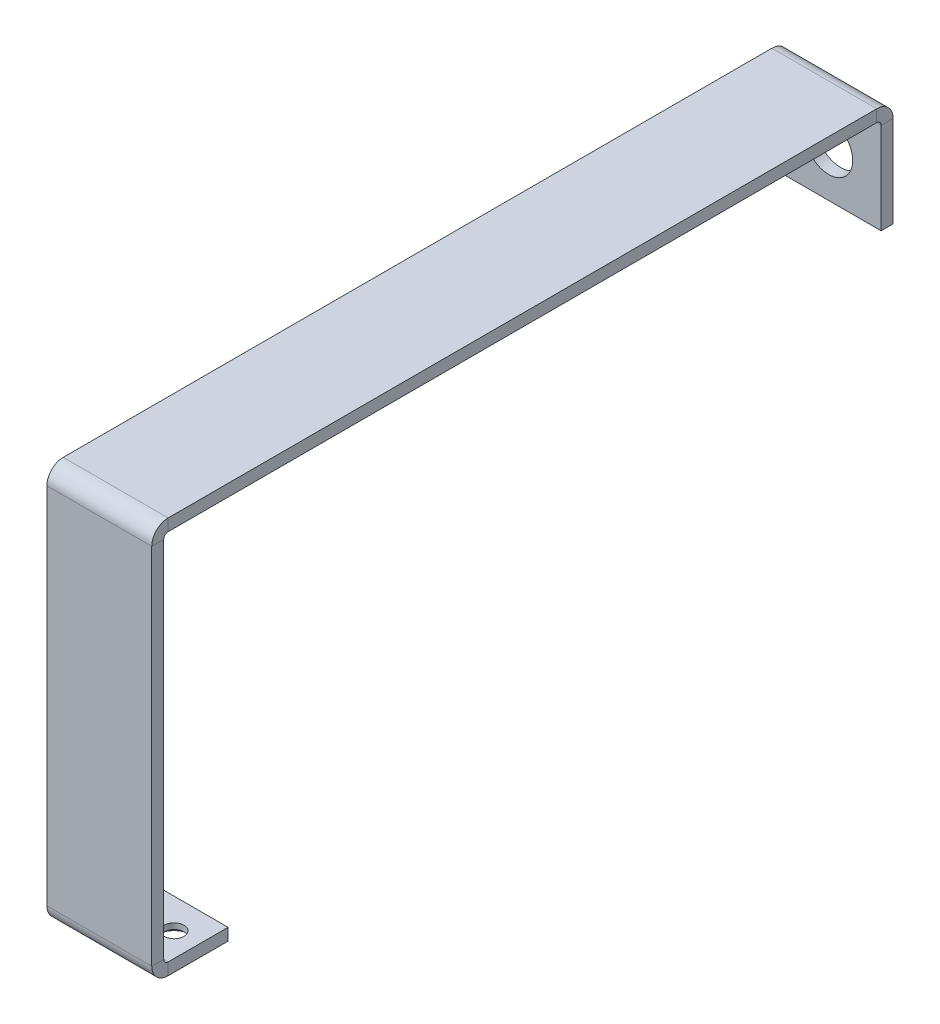
ISO-10303-21;
HEADER;
FILE_DESCRIPTION(('STEP AP214'),'2;1');
FILE_NAME('part.step','',(''),(''),'','','');
FILE_SCHEMA(('AUTOMOTIVE_DESIGN { 1 0 10303 214 1 1 1 1 }'));
ENDSEC;
DATA;
#1=APPLICATION_CONTEXT('core data for automotive mechanical design processes');
#2=APPLICATION_PROTOCOL_DEFINITION('international standard','automotive_design',2000,#1);
#3=PRODUCT_CONTEXT('',#1,'mechanical');
#4=PRODUCT('Part','Part','',(#3));
#5=PRODUCT_RELATED_PRODUCT_CATEGORY('part','',(#4));
#6=PRODUCT_DEFINITION_FORMATION('','',#4);
#7=PRODUCT_DEFINITION_CONTEXT('part definition',#1,'design');
#8=PRODUCT_DEFINITION('design','',#6,#7);
#9=PRODUCT_DEFINITION_SHAPE('','',#8);
#10=(LENGTH_UNIT() NAMED_UNIT(*) SI_UNIT(.MILLI.,.METRE.));
#11=(NAMED_UNIT(*) PLANE_ANGLE_UNIT() SI_UNIT($,.RADIAN.));
#12=(NAMED_UNIT(*) SI_UNIT($,.STERADIAN.) SOLID_ANGLE_UNIT());
#13=UNCERTAINTY_MEASURE_WITH_UNIT(LENGTH_MEASURE(1.E-05),#10,'distance_accuracy_value','');
#14=(GEOMETRIC_REPRESENTATION_CONTEXT(3) GLOBAL_UNCERTAINTY_ASSIGNED_CONTEXT((#13)) GLOBAL_UNIT_ASSIGNED_CONTEXT((#10,
#11,#12)) REPRESENTATION_CONTEXT('',''));
#15=CARTESIAN_POINT('',(0.,0.,0.));
#16=DIRECTION('',(0.,0.,1.));
#17=DIRECTION('',(1.,0.,0.));
#18=AXIS2_PLACEMENT_3D('',#15,#16,#17);
#19=CARTESIAN_POINT('',(0.,2.,0.));
#20=DIRECTION('',(0.,1.,0.));
#21=DIRECTION('',(0.,0.,1.));
#22=AXIS2_PLACEMENT_3D('',#19,#20,#21);
#23=PLANE('',#22);
#24=CARTESIAN_POINT('',(-4.75,2.,0.));
#25=DIRECTION('',(0.,1.,0.));
#26=DIRECTION('',(0.,0.,1.));
#27=AXIS2_PLACEMENT_3D('',#24,#25,#26);
#28=CIRCLE('',#27,1.63194999999999);
#29=CARTESIAN_POINT('',(-4.75,2.,1.63194999999999));
#30=VERTEX_POINT('',#29);
#31=EDGE_CURVE('E450',#30,#30,#28,.F.);
#32=ORIENTED_EDGE('',*,*,#31,.T.);
#33=EDGE_LOOP('',(#32));
#34=FACE_BOUND('',#33,.T.);
#35=DIRECTION('',(0.,0.,-1.));
#36=VECTOR('',#35,1.);
#37=CARTESIAN_POINT('',(8.75,2.,-5.));
#38=LINE('',#37,#36);
#39=CARTESIAN_POINT('',(8.75,2.,5.));
#40=VERTEX_POINT('',#39);
#41=CARTESIAN_POINT('',(8.75,2.,-5.));
#42=VERTEX_POINT('',#41);
#43=EDGE_CURVE('E356',#40,#42,#38,.T.);
#44=ORIENTED_EDGE('',*,*,#43,.T.);
#45=DIRECTION('',(-1.,0.,0.));
#46=VECTOR('',#45,1.);
#47=CARTESIAN_POINT('',(-8.75,2.,-5.));
#48=LINE('',#47,#46);
#49=CARTESIAN_POINT('',(-8.75,2.,-5.));
#50=VERTEX_POINT('',#49);
#51=EDGE_CURVE('E359',#42,#50,#48,.T.);
#52=ORIENTED_EDGE('',*,*,#51,.T.);
#53=DIRECTION('',(0.,0.,1.));
#54=VECTOR('',#53,1.);
#55=CARTESIAN_POINT('',(-8.75,2.,-5.));
#56=LINE('',#55,#54);
#57=CARTESIAN_POINT('',(-8.75,2.,5.));
#58=VERTEX_POINT('',#57);
#59=EDGE_CURVE('E362',#50,#58,#56,.T.);
#60=ORIENTED_EDGE('',*,*,#59,.T.);
#61=DIRECTION('',(1.,0.,0.));
#62=VECTOR('',#61,1.);
#63=CARTESIAN_POINT('',(-8.75,2.,5.));
#64=LINE('',#63,#62);
#65=EDGE_CURVE('E364',#58,#40,#64,.T.);
#66=ORIENTED_EDGE('',*,*,#65,.T.);
#67=EDGE_LOOP('',(#44,#52,#60,#66));
#68=FACE_BOUND('',#67,.T.);
#69=CARTESIAN_POINT('',(4.75,2.,0.));
#70=DIRECTION('',(0.,1.,0.));
#71=DIRECTION('',(0.,0.,1.));
#72=AXIS2_PLACEMENT_3D('',#69,#70,#71);
#73=CIRCLE('',#72,1.63194999999999);
#74=CARTESIAN_POINT('',(4.75,2.,1.63194999999999));
#75=VERTEX_POINT('',#74);
#76=EDGE_CURVE('E441',#75,#75,#73,.F.);
#77=ORIENTED_EDGE('',*,*,#76,.T.);
#78=EDGE_LOOP('',(#77));
#79=FACE_BOUND('',#78,.T.);
#80=ADVANCED_FACE('F103',(#34,#68,#79),#23,.T.);
#81=CARTESIAN_POINT('',(8.74999999999997,66.1500000000004,-115.9484));
#82=DIRECTION('',(-1.,0.,0.));
#83=DIRECTION('',(0.,0.,1.));
#84=AXIS2_PLACEMENT_3D('',#81,#82,#83);
#85=PLANE('',#84);
#86=DIRECTION('',(0.,1.,0.));
#87=VECTOR('',#86,1.);
#88=CARTESIAN_POINT('',(8.75,64.1500000000004,-113.2118));
#89=LINE('',#88,#87);
#90=CARTESIAN_POINT('',(8.74999999999997,64.1500000000004,-113.2118));
#91=VERTEX_POINT('',#90);
#92=CARTESIAN_POINT('',(8.75,66.1500000000004,-113.2118));
#93=VERTEX_POINT('',#92);
#94=EDGE_CURVE('E269',#91,#93,#89,.T.);
#95=ORIENTED_EDGE('',*,*,#94,.T.);
#96=DIRECTION('',(0.,0.,-1.));
#97=VECTOR('',#96,1.);
#98=CARTESIAN_POINT('',(8.74999999999999,66.15,2.39730434382182E-13));
#99=LINE('',#98,#97);
#100=CARTESIAN_POINT('',(8.74999999999999,66.15,5.));
#101=VERTEX_POINT('',#100);
#102=EDGE_CURVE('E288',#101,#93,#99,.T.);
#103=ORIENTED_EDGE('',*,*,#102,.F.);
#104=DIRECTION('',(0.,-1.,0.));
#105=VECTOR('',#104,1.);
#106=CARTESIAN_POINT('',(8.74999999999999,64.15,4.99999999999999));
#107=LINE('',#106,#105);
#108=CARTESIAN_POINT('',(8.74999999999999,64.15,4.99999999999999));
#109=VERTEX_POINT('',#108);
#110=EDGE_CURVE('E297',#109,#101,#107,.F.);
#111=ORIENTED_EDGE('',*,*,#110,.F.);
#112=DIRECTION('',(0.,0.,1.));
#113=VECTOR('',#112,1.);
#114=CARTESIAN_POINT('',(8.74999999999997,64.1500000000004,-115.9484));
#115=LINE('',#114,#113);
#116=EDGE_CURVE('E292',#109,#91,#115,.F.);
#117=ORIENTED_EDGE('',*,*,#116,.T.);
#118=EDGE_LOOP('',(#95,#103,#111,#117));
#119=FACE_BOUND('',#118,.T.);
#120=ADVANCED_FACE('F421',(#119),#85,.F.);
#121=CARTESIAN_POINT('',(-8.75000000000002,66.15,5.7366));
#122=DIRECTION('',(1.,0.,0.));
#123=DIRECTION('',(0.,0.,-1.));
#124=AXIS2_PLACEMENT_3D('',#121,#122,#123);
#125=PLANE('',#124);
#126=DIRECTION('',(0.,1.,0.));
#127=VECTOR('',#126,1.);
#128=CARTESIAN_POINT('',(-8.75,64.1500000000004,-113.2118));
#129=LINE('',#128,#127);
#130=CARTESIAN_POINT('',(-8.75,64.1500000000004,-113.2118));
#131=VERTEX_POINT('',#130);
#132=CARTESIAN_POINT('',(-8.75,66.1500000000004,-113.2118));
#133=VERTEX_POINT('',#132);
#134=EDGE_CURVE('E279',#131,#133,#129,.T.);
#135=ORIENTED_EDGE('',*,*,#134,.F.);
#136=DIRECTION('',(0.,0.,-1.));
#137=VECTOR('',#136,1.);
#138=CARTESIAN_POINT('',(-8.75000000000002,64.15,5.7366));
#139=LINE('',#138,#137);
#140=CARTESIAN_POINT('',(-8.75000000000002,64.15,4.99999999999999));
#141=VERTEX_POINT('',#140);
#142=EDGE_CURVE('E290',#131,#141,#139,.F.);
#143=ORIENTED_EDGE('',*,*,#142,.T.);
#144=DIRECTION('',(0.,-1.,0.));
#145=VECTOR('',#144,1.);
#146=CARTESIAN_POINT('',(-8.75000000000002,66.15,5.));
#147=LINE('',#146,#145);
#148=CARTESIAN_POINT('',(-8.75000000000002,66.15,5.));
#149=VERTEX_POINT('',#148);
#150=EDGE_CURVE('E282',#141,#149,#147,.F.);
#151=ORIENTED_EDGE('',*,*,#150,.T.);
#152=DIRECTION('',(0.,0.,1.));
#153=VECTOR('',#152,1.);
#154=CARTESIAN_POINT('',(-8.75000000000002,66.15,2.40853082808308E-13));
#155=LINE('',#154,#153);
#156=EDGE_CURVE('E285',#133,#149,#155,.T.);
#157=ORIENTED_EDGE('',*,*,#156,.F.);
#158=EDGE_LOOP('',(#135,#143,#151,#157));
#159=FACE_BOUND('',#158,.T.);
#160=ADVANCED_FACE('F495',(#159),#125,.F.);
#161=CARTESIAN_POINT('',(0.,66.15,2.40853082808308E-13));
#162=DIRECTION('',(0.,-1.,0.));
#163=DIRECTION('',(0.,0.,-1.));
#164=AXIS2_PLACEMENT_3D('',#161,#162,#163);
#165=PLANE('',#164);
#166=DIRECTION('',(1.,0.,0.));
#167=VECTOR('',#166,1.);
#168=CARTESIAN_POINT('',(8.75,66.1500000000004,-113.2118));
#169=LINE('',#168,#167);
#170=EDGE_CURVE('E263',#93,#133,#169,.F.);
#171=ORIENTED_EDGE('',*,*,#170,.T.);
#172=ORIENTED_EDGE('',*,*,#156,.T.);
#173=DIRECTION('',(1.,0.,0.));
#174=VECTOR('',#173,1.);
#175=CARTESIAN_POINT('',(-8.75000000000002,66.15,5.));
#176=LINE('',#175,#174);
#177=EDGE_CURVE('E294',#101,#149,#176,.F.);
#178=ORIENTED_EDGE('',*,*,#177,.F.);
#179=ORIENTED_EDGE('',*,*,#102,.T.);
#180=EDGE_LOOP('',(#171,#172,#178,#179));
#181=FACE_BOUND('',#180,.T.);
#182=ADVANCED_FACE('F419',(#181),#165,.F.);
#183=CARTESIAN_POINT('',(0.,64.15,2.33870120130622E-13));
#184=DIRECTION('',(0.,-1.,0.));
#185=DIRECTION('',(0.,0.,-1.));
#186=AXIS2_PLACEMENT_3D('',#183,#184,#185);
#187=PLANE('',#186);
#188=ORIENTED_EDGE('',*,*,#142,.F.);
#189=DIRECTION('',(1.,0.,0.));
#190=VECTOR('',#189,1.);
#191=CARTESIAN_POINT('',(8.75,64.1500000000004,-113.2118));
#192=LINE('',#191,#190);
#193=EDGE_CURVE('E118',#91,#131,#192,.F.);
#194=ORIENTED_EDGE('',*,*,#193,.F.);
#195=ORIENTED_EDGE('',*,*,#116,.F.);
#196=DIRECTION('',(1.,0.,0.));
#197=VECTOR('',#196,1.);
#198=CARTESIAN_POINT('',(-8.75000000000002,64.15,4.99999999999999));
#199=LINE('',#198,#197);
#200=EDGE_CURVE('E300',#141,#109,#199,.T.);
#201=ORIENTED_EDGE('',*,*,#200,.F.);
#202=EDGE_LOOP('',(#188,#194,#195,#201));
#203=FACE_BOUND('',#202,.T.);
#204=ADVANCED_FACE('F527',(#203),#187,.T.);
#205=CARTESIAN_POINT('',(8.74999999999999,66.15,7.7366));
#206=DIRECTION('',(-1.,0.,0.));
#207=DIRECTION('',(0.,-1.,0.));
#208=AXIS2_PLACEMENT_3D('',#205,#206,#207);
#209=PLANE('',#208);
#210=DIRECTION('',(0.,0.,1.));
#211=VECTOR('',#210,1.);
#212=CARTESIAN_POINT('',(8.74999999999999,63.4134,5.73659999999999));
#213=LINE('',#212,#211);
#214=CARTESIAN_POINT('',(8.74999999999999,63.4134,5.7366));
#215=VERTEX_POINT('',#214);
#216=CARTESIAN_POINT('',(8.74999999999999,63.4134,7.73659999999999));
#217=VERTEX_POINT('',#216);
#218=EDGE_CURVE('E310',#215,#217,#213,.T.);
#219=ORIENTED_EDGE('',*,*,#218,.T.);
#220=DIRECTION('',(0.,1.,0.));
#221=VECTOR('',#220,1.);
#222=CARTESIAN_POINT('',(8.74999999999999,0.,7.7366));
#223=LINE('',#222,#221);
#224=CARTESIAN_POINT('',(8.74999999999999,2.7366,7.7366));
#225=VERTEX_POINT('',#224);
#226=EDGE_CURVE('E328',#225,#217,#223,.T.);
#227=ORIENTED_EDGE('',*,*,#226,.F.);
#228=DIRECTION('',(0.,0.,-1.));
#229=VECTOR('',#228,1.);
#230=CARTESIAN_POINT('',(8.74999999999999,2.7366,5.7366));
#231=LINE('',#230,#229);
#232=CARTESIAN_POINT('',(8.74999999999999,2.7366,5.7366));
#233=VERTEX_POINT('',#232);
#234=EDGE_CURVE('E337',#233,#225,#231,.F.);
#235=ORIENTED_EDGE('',*,*,#234,.F.);
#236=DIRECTION('',(0.,-1.,0.));
#237=VECTOR('',#236,1.);
#238=CARTESIAN_POINT('',(8.74999999999999,66.15,5.7366));
#239=LINE('',#238,#237);
#240=EDGE_CURVE('E332',#233,#215,#239,.F.);
#241=ORIENTED_EDGE('',*,*,#240,.T.);
#242=EDGE_LOOP('',(#219,#227,#235,#241));
#243=FACE_BOUND('',#242,.T.);
#244=ADVANCED_FACE('F405',(#243),#209,.F.);
#245=CARTESIAN_POINT('',(-8.74999999999999,2.,7.7366));
#246=DIRECTION('',(1.,0.,0.));
#247=DIRECTION('',(0.,1.,0.));
#248=AXIS2_PLACEMENT_3D('',#245,#246,#247);
#249=PLANE('',#248);
#250=DIRECTION('',(0.,0.,1.));
#251=VECTOR('',#250,1.);
#252=CARTESIAN_POINT('',(-8.75000000000002,63.4134,5.73659999999999));
#253=LINE('',#252,#251);
#254=CARTESIAN_POINT('',(-8.75000000000002,63.4134,5.73659999999999));
#255=VERTEX_POINT('',#254);
#256=CARTESIAN_POINT('',(-8.75000000000002,63.4134,7.7366));
#257=VERTEX_POINT('',#256);
#258=EDGE_CURVE('E319',#255,#257,#253,.T.);
#259=ORIENTED_EDGE('',*,*,#258,.F.);
#260=DIRECTION('',(0.,1.,0.));
#261=VECTOR('',#260,1.);
#262=CARTESIAN_POINT('',(-8.74999999999999,2.,5.7366));
#263=LINE('',#262,#261);
#264=CARTESIAN_POINT('',(-8.74999999999998,2.7366,5.7366));
#265=VERTEX_POINT('',#264);
#266=EDGE_CURVE('E330',#255,#265,#263,.F.);
#267=ORIENTED_EDGE('',*,*,#266,.T.);
#268=DIRECTION('',(0.,0.,-1.));
#269=VECTOR('',#268,1.);
#270=CARTESIAN_POINT('',(-8.74999999999999,2.7366,7.7366));
#271=LINE('',#270,#269);
#272=CARTESIAN_POINT('',(-8.74999999999998,2.7366,7.7366));
#273=VERTEX_POINT('',#272);
#274=EDGE_CURVE('E322',#265,#273,#271,.F.);
#275=ORIENTED_EDGE('',*,*,#274,.T.);
#276=DIRECTION('',(0.,-1.,0.));
#277=VECTOR('',#276,1.);
#278=CARTESIAN_POINT('',(-8.74999999999999,0.,7.7366));
#279=LINE('',#278,#277);
#280=EDGE_CURVE('E325',#257,#273,#279,.T.);
#281=ORIENTED_EDGE('',*,*,#280,.F.);
#282=EDGE_LOOP('',(#259,#267,#275,#281));
#283=FACE_BOUND('',#282,.T.);
#284=ADVANCED_FACE('F559',(#283),#249,.F.);
#285=CARTESIAN_POINT('',(0.,0.,7.7366));
#286=DIRECTION('',(0.,0.,-1.));
#287=DIRECTION('',(-1.,0.,0.));
#288=AXIS2_PLACEMENT_3D('',#285,#286,#287);
#289=PLANE('',#288);
#290=DIRECTION('',(1.,0.,0.));
#291=VECTOR('',#290,1.);
#292=CARTESIAN_POINT('',(8.74999999999999,63.4134,7.73659999999999));
#293=LINE('',#292,#291);
#294=EDGE_CURVE('E304',#217,#257,#293,.F.);
#295=ORIENTED_EDGE('',*,*,#294,.T.);
#296=ORIENTED_EDGE('',*,*,#280,.T.);
#297=DIRECTION('',(1.,0.,0.));
#298=VECTOR('',#297,1.);
#299=CARTESIAN_POINT('',(-8.75,2.7366,7.7366));
#300=LINE('',#299,#298);
#301=EDGE_CURVE('E334',#225,#273,#300,.F.);
#302=ORIENTED_EDGE('',*,*,#301,.F.);
#303=ORIENTED_EDGE('',*,*,#226,.T.);
#304=EDGE_LOOP('',(#295,#296,#302,#303));
#305=FACE_BOUND('',#304,.T.);
#306=ADVANCED_FACE('F401',(#305),#289,.F.);
#307=CARTESIAN_POINT('',(0.,0.,5.7366));
#308=DIRECTION('',(0.,0.,-1.));
#309=DIRECTION('',(-1.,0.,0.));
#310=AXIS2_PLACEMENT_3D('',#307,#308,#309);
#311=PLANE('',#310);
#312=ORIENTED_EDGE('',*,*,#266,.F.);
#313=DIRECTION('',(1.,0.,0.));
#314=VECTOR('',#313,1.);
#315=CARTESIAN_POINT('',(8.74999999999999,63.4134,5.73659999999999));
#316=LINE('',#315,#314);
#317=EDGE_CURVE('E126',#215,#255,#316,.F.);
#318=ORIENTED_EDGE('',*,*,#317,.F.);
#319=ORIENTED_EDGE('',*,*,#240,.F.);
#320=DIRECTION('',(1.,0.,0.));
#321=VECTOR('',#320,1.);
#322=CARTESIAN_POINT('',(-8.75,2.7366,5.7366));
#323=LINE('',#322,#321);
#324=EDGE_CURVE('E340',#265,#233,#323,.T.);
#325=ORIENTED_EDGE('',*,*,#324,.F.);
#326=EDGE_LOOP('',(#312,#318,#319,#325));
#327=FACE_BOUND('',#326,.T.);
#328=ADVANCED_FACE('F508',(#327),#311,.T.);
#329=CARTESIAN_POINT('',(8.75,2.,-5.));
#330=DIRECTION('',(-1.,0.,0.));
#331=DIRECTION('',(0.,0.,1.));
#332=AXIS2_PLACEMENT_3D('',#329,#330,#331);
#333=PLANE('',#332);
#334=DIRECTION('',(0.,0.,-1.));
#335=VECTOR('',#334,1.);
#336=CARTESIAN_POINT('',(8.75,0.,-5.));
#337=LINE('',#336,#335);
#338=CARTESIAN_POINT('',(8.74999999999999,0.,5.));
#339=VERTEX_POINT('',#338);
#340=CARTESIAN_POINT('',(8.75,0.,-5.));
#341=VERTEX_POINT('',#340);
#342=EDGE_CURVE('E347',#339,#341,#337,.T.);
#343=ORIENTED_EDGE('',*,*,#342,.T.);
#344=DIRECTION('',(0.,-1.,0.));
#345=VECTOR('',#344,1.);
#346=CARTESIAN_POINT('',(8.75,2.,-5.));
#347=LINE('',#346,#345);
#348=EDGE_CURVE('E13',#42,#341,#347,.T.);
#349=ORIENTED_EDGE('',*,*,#348,.F.);
#350=ORIENTED_EDGE('',*,*,#43,.F.);
#351=DIRECTION('',(0.,-1.,0.));
#352=VECTOR('',#351,1.);
#353=CARTESIAN_POINT('',(8.75,2.,5.));
#354=LINE('',#353,#352);
#355=EDGE_CURVE('E366',#40,#339,#354,.T.);
#356=ORIENTED_EDGE('',*,*,#355,.T.);
#357=EDGE_LOOP('',(#343,#349,#350,#356));
#358=FACE_BOUND('',#357,.T.);
#359=ADVANCED_FACE('F105',(#358),#333,.F.);
#360=CARTESIAN_POINT('',(-8.75,2.,-5.));
#361=DIRECTION('',(0.,0.,1.));
#362=DIRECTION('',(1.,0.,0.));
#363=AXIS2_PLACEMENT_3D('',#360,#361,#362);
#364=PLANE('',#363);
#365=DIRECTION('',(-1.,0.,0.));
#366=VECTOR('',#365,1.);
#367=CARTESIAN_POINT('',(-8.75,0.,-5.));
#368=LINE('',#367,#366);
#369=CARTESIAN_POINT('',(-8.75,0.,-5.));
#370=VERTEX_POINT('',#369);
#371=EDGE_CURVE('E369',#341,#370,#368,.T.);
#372=ORIENTED_EDGE('',*,*,#371,.T.);
#373=DIRECTION('',(0.,-1.,0.));
#374=VECTOR('',#373,1.);
#375=CARTESIAN_POINT('',(-8.75,2.,-5.));
#376=LINE('',#375,#374);
#377=EDGE_CURVE('E111',#50,#370,#376,.T.);
#378=ORIENTED_EDGE('',*,*,#377,.F.);
#379=ORIENTED_EDGE('',*,*,#51,.F.);
#380=ORIENTED_EDGE('',*,*,#348,.T.);
#381=EDGE_LOOP('',(#372,#378,#379,#380));
#382=FACE_BOUND('',#381,.T.);
#383=ADVANCED_FACE('F503',(#382),#364,.F.);
#384=CARTESIAN_POINT('',(-8.75,2.,-5.));
#385=DIRECTION('',(1.,0.,0.));
#386=DIRECTION('',(0.,0.,-1.));
#387=AXIS2_PLACEMENT_3D('',#384,#385,#386);
#388=PLANE('',#387);
#389=DIRECTION('',(0.,0.,1.));
#390=VECTOR('',#389,1.);
#391=CARTESIAN_POINT('',(-8.75,0.,-5.));
#392=LINE('',#391,#390);
#393=CARTESIAN_POINT('',(-8.75,0.,5.));
#394=VERTEX_POINT('',#393);
#395=EDGE_CURVE('E371',#370,#394,#392,.T.);
#396=ORIENTED_EDGE('',*,*,#395,.T.);
#397=DIRECTION('',(0.,-1.,0.));
#398=VECTOR('',#397,1.);
#399=CARTESIAN_POINT('',(-8.75,2.,5.));
#400=LINE('',#399,#398);
#401=EDGE_CURVE('E377',#58,#394,#400,.T.);
#402=ORIENTED_EDGE('',*,*,#401,.F.);
#403=ORIENTED_EDGE('',*,*,#59,.F.);
#404=ORIENTED_EDGE('',*,*,#377,.T.);
#405=EDGE_LOOP('',(#396,#402,#403,#404));
#406=FACE_BOUND('',#405,.T.);
#407=ADVANCED_FACE('F384',(#406),#388,.F.);
#408=CARTESIAN_POINT('',(0.,0.,0.));
#409=DIRECTION('',(0.,1.,0.));
#410=DIRECTION('',(0.,0.,1.));
#411=AXIS2_PLACEMENT_3D('',#408,#409,#410);
#412=PLANE('',#411);
#413=CARTESIAN_POINT('',(-4.75,0.,0.));
#414=DIRECTION('',(0.,-1.,0.));
#415=DIRECTION('',(0.,0.,-1.));
#416=AXIS2_PLACEMENT_3D('',#413,#414,#415);
#417=CIRCLE('',#416,2.8575);
#418=CARTESIAN_POINT('',(-4.75,0.,-2.8575));
#419=VERTEX_POINT('',#418);
#420=EDGE_CURVE('E453',#419,#419,#417,.T.);
#421=ORIENTED_EDGE('',*,*,#420,.F.);
#422=EDGE_LOOP('',(#421));
#423=FACE_BOUND('',#422,.T.);
#424=CARTESIAN_POINT('',(4.75,0.,0.));
#425=DIRECTION('',(0.,-1.,0.));
#426=DIRECTION('',(0.,0.,-1.));
#427=AXIS2_PLACEMENT_3D('',#424,#425,#426);
#428=CIRCLE('',#427,2.8575);
#429=CARTESIAN_POINT('',(4.75,0.,-2.8575));
#430=VERTEX_POINT('',#429);
#431=EDGE_CURVE('E444',#430,#430,#428,.T.);
#432=ORIENTED_EDGE('',*,*,#431,.F.);
#433=EDGE_LOOP('',(#432));
#434=FACE_BOUND('',#433,.T.);
#435=ORIENTED_EDGE('',*,*,#342,.F.);
#436=DIRECTION('',(1.,0.,0.));
#437=VECTOR('',#436,1.);
#438=CARTESIAN_POINT('',(-8.75,0.,5.));
#439=LINE('',#438,#437);
#440=EDGE_CURVE('E360',#394,#339,#439,.T.);
#441=ORIENTED_EDGE('',*,*,#440,.F.);
#442=ORIENTED_EDGE('',*,*,#395,.F.);
#443=ORIENTED_EDGE('',*,*,#371,.F.);
#444=EDGE_LOOP('',(#435,#441,#442,#443));
#445=FACE_BOUND('',#444,.T.);
#446=ADVANCED_FACE('F389',(#423,#434,#445),#412,.F.);
#447=CARTESIAN_POINT('',(-8.74999999999999,2.7366,5.));
#448=DIRECTION('',(-1.,0.,0.));
#449=DIRECTION('',(0.,0.,1.));
#450=AXIS2_PLACEMENT_3D('',#447,#448,#449);
#451=PLANE('',#450);
#452=ORIENTED_EDGE('',*,*,#274,.F.);
#453=CARTESIAN_POINT('',(-8.74999999999999,2.7366,5.));
#454=DIRECTION('',(1.,0.,0.));
#455=DIRECTION('',(0.,0.,-1.));
#456=AXIS2_PLACEMENT_3D('',#453,#454,#455);
#457=CIRCLE('',#456,0.736599999999998);
#458=EDGE_CURVE('E351',#58,#265,#457,.F.);
#459=ORIENTED_EDGE('',*,*,#458,.F.);
#460=ORIENTED_EDGE('',*,*,#401,.T.);
#461=CARTESIAN_POINT('',(-8.74999999999998,2.7366,5.));
#462=DIRECTION('',(1.,0.,0.));
#463=DIRECTION('',(0.,0.,-1.));
#464=AXIS2_PLACEMENT_3D('',#461,#462,#463);
#465=CIRCLE('',#464,2.7366);
#466=EDGE_CURVE('E344',#394,#273,#465,.F.);
#467=ORIENTED_EDGE('',*,*,#466,.T.);
#468=EDGE_LOOP('',(#452,#459,#460,#467));
#469=FACE_BOUND('',#468,.T.);
#470=ADVANCED_FACE('F395',(#469),#451,.T.);
#471=CARTESIAN_POINT('',(8.74999999999999,2.7366,5.));
#472=DIRECTION('',(-1.,0.,0.));
#473=DIRECTION('',(0.,0.,1.));
#474=AXIS2_PLACEMENT_3D('',#471,#472,#473);
#475=PLANE('',#474);
#476=CARTESIAN_POINT('',(8.74999999999999,2.7366,5.));
#477=DIRECTION('',(1.,0.,0.));
#478=DIRECTION('',(0.,0.,-1.));
#479=AXIS2_PLACEMENT_3D('',#476,#477,#478);
#480=CIRCLE('',#479,0.736599999999998);
#481=EDGE_CURVE('E327',#233,#40,#480,.T.);
#482=ORIENTED_EDGE('',*,*,#481,.F.);
#483=ORIENTED_EDGE('',*,*,#234,.T.);
#484=CARTESIAN_POINT('',(8.74999999999999,2.7366,5.));
#485=DIRECTION('',(1.,0.,0.));
#486=DIRECTION('',(0.,0.,-1.));
#487=AXIS2_PLACEMENT_3D('',#484,#485,#486);
#488=CIRCLE('',#487,2.7366);
#489=EDGE_CURVE('E348',#225,#339,#488,.T.);
#490=ORIENTED_EDGE('',*,*,#489,.T.);
#491=ORIENTED_EDGE('',*,*,#355,.F.);
#492=EDGE_LOOP('',(#482,#483,#490,#491));
#493=FACE_BOUND('',#492,.T.);
#494=ADVANCED_FACE('F499',(#493),#475,.F.);
#495=CARTESIAN_POINT('',(8.74999999999999,2.7366,5.));
#496=DIRECTION('',(1.,0.,0.));
#497=DIRECTION('',(0.,0.,1.));
#498=AXIS2_PLACEMENT_3D('',#495,#496,#497);
#499=CYLINDRICAL_SURFACE('',#498,2.7366);
#500=ORIENTED_EDGE('',*,*,#440,.T.);
#501=ORIENTED_EDGE('',*,*,#489,.F.);
#502=ORIENTED_EDGE('',*,*,#301,.T.);
#503=ORIENTED_EDGE('',*,*,#466,.F.);
#504=EDGE_LOOP('',(#500,#501,#502,#503));
#505=FACE_BOUND('',#504,.T.);
#506=ADVANCED_FACE('F397',(#505),#499,.T.);
#507=CARTESIAN_POINT('',(8.74999999999999,2.7366,5.));
#508=DIRECTION('',(1.,0.,0.));
#509=DIRECTION('',(0.,0.,1.));
#510=AXIS2_PLACEMENT_3D('',#507,#508,#509);
#511=CYLINDRICAL_SURFACE('',#510,0.736599999999998);
#512=ORIENTED_EDGE('',*,*,#65,.F.);
#513=ORIENTED_EDGE('',*,*,#458,.T.);
#514=ORIENTED_EDGE('',*,*,#324,.T.);
#515=ORIENTED_EDGE('',*,*,#481,.T.);
#516=EDGE_LOOP('',(#512,#513,#514,#515));
#517=FACE_BOUND('',#516,.T.);
#518=ADVANCED_FACE('F516',(#517),#511,.F.);
#519=CARTESIAN_POINT('',(-8.75000000000002,63.4134,4.99999999999999));
#520=DIRECTION('',(-1.,0.,0.));
#521=DIRECTION('',(0.,0.,1.));
#522=AXIS2_PLACEMENT_3D('',#519,#520,#521);
#523=PLANE('',#522);
#524=ORIENTED_EDGE('',*,*,#150,.F.);
#525=CARTESIAN_POINT('',(-8.75000000000002,63.4134,4.99999999999999));
#526=DIRECTION('',(1.,0.,0.));
#527=DIRECTION('',(0.,0.,-1.));
#528=AXIS2_PLACEMENT_3D('',#525,#526,#527);
#529=CIRCLE('',#528,0.736600000000004);
#530=EDGE_CURVE('E313',#255,#141,#529,.F.);
#531=ORIENTED_EDGE('',*,*,#530,.F.);
#532=ORIENTED_EDGE('',*,*,#258,.T.);
#533=CARTESIAN_POINT('',(-8.75000000000002,63.4134,4.99999999999999));
#534=DIRECTION('',(1.,0.,0.));
#535=DIRECTION('',(0.,0.,-1.));
#536=AXIS2_PLACEMENT_3D('',#533,#534,#535);
#537=CIRCLE('',#536,2.7366);
#538=EDGE_CURVE('E306',#257,#149,#537,.F.);
#539=ORIENTED_EDGE('',*,*,#538,.T.);
#540=EDGE_LOOP('',(#524,#531,#532,#539));
#541=FACE_BOUND('',#540,.T.);
#542=ADVANCED_FACE('F525',(#541),#523,.T.);
#543=CARTESIAN_POINT('',(8.74999999999999,63.4134,4.99999999999999));
#544=DIRECTION('',(-1.,0.,0.));
#545=DIRECTION('',(0.,0.,1.));
#546=AXIS2_PLACEMENT_3D('',#543,#544,#545);
#547=PLANE('',#546);
#548=CARTESIAN_POINT('',(8.74999999999999,63.4134,4.99999999999999));
#549=DIRECTION('',(1.,0.,0.));
#550=DIRECTION('',(0.,0.,-1.));
#551=AXIS2_PLACEMENT_3D('',#548,#549,#550);
#552=CIRCLE('',#551,0.736600000000004);
#553=EDGE_CURVE('E287',#109,#215,#552,.T.);
#554=ORIENTED_EDGE('',*,*,#553,.F.);
#555=ORIENTED_EDGE('',*,*,#110,.T.);
#556=CARTESIAN_POINT('',(8.74999999999999,63.4134,4.99999999999999));
#557=DIRECTION('',(1.,0.,0.));
#558=DIRECTION('',(0.,0.,-1.));
#559=AXIS2_PLACEMENT_3D('',#556,#557,#558);
#560=CIRCLE('',#559,2.7366);
#561=EDGE_CURVE('E307',#101,#217,#560,.T.);
#562=ORIENTED_EDGE('',*,*,#561,.T.);
#563=ORIENTED_EDGE('',*,*,#218,.F.);
#564=EDGE_LOOP('',(#554,#555,#562,#563));
#565=FACE_BOUND('',#564,.T.);
#566=ADVANCED_FACE('F413',(#565),#547,.F.);
#567=CARTESIAN_POINT('',(8.74999999999999,63.4134,4.99999999999999));
#568=DIRECTION('',(1.,0.,0.));
#569=DIRECTION('',(0.,1.,0.));
#570=AXIS2_PLACEMENT_3D('',#567,#568,#569);
#571=CYLINDRICAL_SURFACE('',#570,2.7366);
#572=ORIENTED_EDGE('',*,*,#294,.F.);
#573=ORIENTED_EDGE('',*,*,#561,.F.);
#574=ORIENTED_EDGE('',*,*,#177,.T.);
#575=ORIENTED_EDGE('',*,*,#538,.F.);
#576=EDGE_LOOP('',(#572,#573,#574,#575));
#577=FACE_BOUND('',#576,.T.);
#578=ADVANCED_FACE('F412',(#577),#571,.T.);
#579=CARTESIAN_POINT('',(8.74999999999999,63.4134,4.99999999999999));
#580=DIRECTION('',(1.,0.,0.));
#581=DIRECTION('',(0.,1.,0.));
#582=AXIS2_PLACEMENT_3D('',#579,#580,#581);
#583=CYLINDRICAL_SURFACE('',#582,0.736600000000004);
#584=ORIENTED_EDGE('',*,*,#317,.T.);
#585=ORIENTED_EDGE('',*,*,#530,.T.);
#586=ORIENTED_EDGE('',*,*,#200,.T.);
#587=ORIENTED_EDGE('',*,*,#553,.T.);
#588=EDGE_LOOP('',(#584,#585,#586,#587));
#589=FACE_BOUND('',#588,.T.);
#590=ADVANCED_FACE('F521',(#589),#583,.F.);
#591=CARTESIAN_POINT('',(-8.75,63.4134000000004,-113.2118));
#592=DIRECTION('',(-1.,0.,0.));
#593=DIRECTION('',(0.,0.,1.));
#594=AXIS2_PLACEMENT_3D('',#591,#592,#593);
#595=PLANE('',#594);
#596=DIRECTION('',(0.,0.,1.));
#597=VECTOR('',#596,1.);
#598=CARTESIAN_POINT('',(-8.75,63.4134000000004,-115.9484));
#599=LINE('',#598,#597);
#600=CARTESIAN_POINT('',(-8.75,63.4134000000004,-113.9484));
#601=VERTEX_POINT('',#600);
#602=CARTESIAN_POINT('',(-8.75,63.4134000000004,-115.9484));
#603=VERTEX_POINT('',#602);
#604=EDGE_CURVE('E244',#601,#603,#599,.F.);
#605=ORIENTED_EDGE('',*,*,#604,.F.);
#606=CARTESIAN_POINT('',(-8.75,63.4134000000004,-113.2118));
#607=DIRECTION('',(1.,0.,0.));
#608=DIRECTION('',(0.,0.,-1.));
#609=AXIS2_PLACEMENT_3D('',#606,#607,#608);
#610=CIRCLE('',#609,0.736600000000004);
#611=EDGE_CURVE('E272',#131,#601,#610,.F.);
#612=ORIENTED_EDGE('',*,*,#611,.F.);
#613=ORIENTED_EDGE('',*,*,#134,.T.);
#614=CARTESIAN_POINT('',(-8.75,63.4134000000004,-113.2118));
#615=DIRECTION('',(1.,0.,0.));
#616=DIRECTION('',(0.,0.,-1.));
#617=AXIS2_PLACEMENT_3D('',#614,#615,#616);
#618=CIRCLE('',#617,2.7366);
#619=EDGE_CURVE('E265',#133,#603,#618,.F.);
#620=ORIENTED_EDGE('',*,*,#619,.T.);
#621=EDGE_LOOP('',(#605,#612,#613,#620));
#622=FACE_BOUND('',#621,.T.);
#623=ADVANCED_FACE('F533',(#622),#595,.T.);
#624=CARTESIAN_POINT('',(8.75,63.4134000000004,-113.2118));
#625=DIRECTION('',(-1.,0.,0.));
#626=DIRECTION('',(0.,0.,1.));
#627=AXIS2_PLACEMENT_3D('',#624,#625,#626);
#628=PLANE('',#627);
#629=CARTESIAN_POINT('',(8.75,63.4134000000004,-113.2118));
#630=DIRECTION('',(1.,0.,0.));
#631=DIRECTION('',(0.,0.,-1.));
#632=AXIS2_PLACEMENT_3D('',#629,#630,#631);
#633=CIRCLE('',#632,0.736600000000004);
#634=CARTESIAN_POINT('',(8.75,63.4134000000004,-113.9484));
#635=VERTEX_POINT('',#634);
#636=EDGE_CURVE('E276',#635,#91,#633,.T.);
#637=ORIENTED_EDGE('',*,*,#636,.F.);
#638=DIRECTION('',(0.,0.,1.));
#639=VECTOR('',#638,1.);
#640=CARTESIAN_POINT('',(8.75,63.4134000000004,-113.9484));
#641=LINE('',#640,#639);
#642=CARTESIAN_POINT('',(8.75,63.4134000000004,-115.9484));
#643=VERTEX_POINT('',#642);
#644=EDGE_CURVE('E256',#635,#643,#641,.F.);
#645=ORIENTED_EDGE('',*,*,#644,.T.);
#646=CARTESIAN_POINT('',(8.75,63.4134000000004,-113.2118));
#647=DIRECTION('',(1.,0.,0.));
#648=DIRECTION('',(0.,0.,-1.));
#649=AXIS2_PLACEMENT_3D('',#646,#647,#648);
#650=CIRCLE('',#649,2.7366);
#651=EDGE_CURVE('E266',#643,#93,#650,.T.);
#652=ORIENTED_EDGE('',*,*,#651,.T.);
#653=ORIENTED_EDGE('',*,*,#94,.F.);
#654=EDGE_LOOP('',(#637,#645,#652,#653));
#655=FACE_BOUND('',#654,.T.);
#656=ADVANCED_FACE('F429',(#655),#628,.F.);
#657=CARTESIAN_POINT('',(8.75,63.4134000000004,-113.2118));
#658=DIRECTION('',(1.,0.,0.));
#659=DIRECTION('',(0.,0.,-1.));
#660=AXIS2_PLACEMENT_3D('',#657,#658,#659);
#661=CYLINDRICAL_SURFACE('',#660,2.7366);
#662=ORIENTED_EDGE('',*,*,#170,.F.);
#663=ORIENTED_EDGE('',*,*,#651,.F.);
#664=DIRECTION('',(1.,0.,0.));
#665=VECTOR('',#664,1.);
#666=CARTESIAN_POINT('',(-8.75,63.4134000000004,-115.9484));
#667=LINE('',#666,#665);
#668=EDGE_CURVE('E254',#643,#603,#667,.F.);
#669=ORIENTED_EDGE('',*,*,#668,.T.);
#670=ORIENTED_EDGE('',*,*,#619,.F.);
#671=EDGE_LOOP('',(#662,#663,#669,#670));
#672=FACE_BOUND('',#671,.T.);
#673=ADVANCED_FACE('F428',(#672),#661,.T.);
#674=CARTESIAN_POINT('',(8.75,63.4134000000004,-113.2118));
#675=DIRECTION('',(1.,0.,0.));
#676=DIRECTION('',(0.,0.,-1.));
#677=AXIS2_PLACEMENT_3D('',#674,#675,#676);
#678=CYLINDRICAL_SURFACE('',#677,0.736600000000004);
#679=ORIENTED_EDGE('',*,*,#193,.T.);
#680=ORIENTED_EDGE('',*,*,#611,.T.);
#681=DIRECTION('',(1.,0.,0.));
#682=VECTOR('',#681,1.);
#683=CARTESIAN_POINT('',(-8.75,63.4134000000004,-113.9484));
#684=LINE('',#683,#682);
#685=EDGE_CURVE('E259',#601,#635,#684,.T.);
#686=ORIENTED_EDGE('',*,*,#685,.T.);
#687=ORIENTED_EDGE('',*,*,#636,.T.);
#688=EDGE_LOOP('',(#679,#680,#686,#687));
#689=FACE_BOUND('',#688,.T.);
#690=ADVANCED_FACE('F530',(#689),#678,.F.);
#691=CARTESIAN_POINT('',(8.75,48.1500000000004,-115.9484));
#692=DIRECTION('',(-1.,0.,0.));
#693=DIRECTION('',(0.,0.,1.));
#694=AXIS2_PLACEMENT_3D('',#691,#692,#693);
#695=PLANE('',#694);
#696=ORIENTED_EDGE('',*,*,#644,.F.);
#697=DIRECTION('',(0.,1.,0.));
#698=VECTOR('',#697,1.);
#699=CARTESIAN_POINT('',(8.75,48.1500000000004,-113.9484));
#700=LINE('',#699,#698);
#701=CARTESIAN_POINT('',(8.75,48.1500000000004,-113.9484));
#702=VERTEX_POINT('',#701);
#703=EDGE_CURVE('E252',#635,#702,#700,.F.);
#704=ORIENTED_EDGE('',*,*,#703,.T.);
#705=DIRECTION('',(0.,0.,1.));
#706=VECTOR('',#705,1.);
#707=CARTESIAN_POINT('',(8.75,48.1500000000004,-115.9484));
#708=LINE('',#707,#706);
#709=CARTESIAN_POINT('',(8.75,48.1500000000004,-115.9484));
#710=VERTEX_POINT('',#709);
#711=EDGE_CURVE('E240',#710,#702,#708,.T.);
#712=ORIENTED_EDGE('',*,*,#711,.F.);
#713=DIRECTION('',(0.,-1.,0.));
#714=VECTOR('',#713,1.);
#715=CARTESIAN_POINT('',(8.75,8.11536608605486E-13,-115.9484));
#716=LINE('',#715,#714);
#717=EDGE_CURVE('E227',#643,#710,#716,.T.);
#718=ORIENTED_EDGE('',*,*,#717,.F.);
#719=EDGE_LOOP('',(#696,#704,#712,#718));
#720=FACE_BOUND('',#719,.T.);
#721=ADVANCED_FACE('F433',(#720),#695,.F.);
#722=CARTESIAN_POINT('',(-8.75,64.1500000000004,-115.9484));
#723=DIRECTION('',(1.,0.,0.));
#724=DIRECTION('',(0.,1.,0.));
#725=AXIS2_PLACEMENT_3D('',#722,#723,#724);
#726=PLANE('',#725);
#727=ORIENTED_EDGE('',*,*,#604,.T.);
#728=DIRECTION('',(0.,1.,0.));
#729=VECTOR('',#728,1.);
#730=CARTESIAN_POINT('',(-8.75000000000004,8.17228670011035E-13,-115.9484));
#731=LINE('',#730,#729);
#732=CARTESIAN_POINT('',(-8.75000000000001,48.1500000000004,-115.9484));
#733=VERTEX_POINT('',#732);
#734=EDGE_CURVE('E225',#733,#603,#731,.T.);
#735=ORIENTED_EDGE('',*,*,#734,.F.);
#736=DIRECTION('',(0.,0.,1.));
#737=VECTOR('',#736,1.);
#738=CARTESIAN_POINT('',(-8.75000000000001,48.1500000000004,-115.9484));
#739=LINE('',#738,#737);
#740=CARTESIAN_POINT('',(-8.75000000000001,48.1500000000004,-113.9484));
#741=VERTEX_POINT('',#740);
#742=EDGE_CURVE('E233',#733,#741,#739,.T.);
#743=ORIENTED_EDGE('',*,*,#742,.T.);
#744=DIRECTION('',(0.,-1.,0.));
#745=VECTOR('',#744,1.);
#746=CARTESIAN_POINT('',(-8.75,64.1500000000004,-113.9484));
#747=LINE('',#746,#745);
#748=EDGE_CURVE('E249',#741,#601,#747,.F.);
#749=ORIENTED_EDGE('',*,*,#748,.T.);
#750=EDGE_LOOP('',(#727,#735,#743,#749));
#751=FACE_BOUND('',#750,.T.);
#752=ADVANCED_FACE('F243',(#751),#726,.F.);
#753=CARTESIAN_POINT('',(0.,8.11536608605486E-13,-115.9484));
#754=DIRECTION('',(0.,0.,1.));
#755=DIRECTION('',(0.,-1.,0.));
#756=AXIS2_PLACEMENT_3D('',#753,#754,#755);
#757=PLANE('',#756);
#758=CARTESIAN_POINT('',(0.,55.9134000000004,-115.9484));
#759=DIRECTION('',(0.,0.,-1.));
#760=DIRECTION('',(0.,1.,0.));
#761=AXIS2_PLACEMENT_3D('',#758,#759,#760);
#762=CIRCLE('',#761,4.);
#763=CARTESIAN_POINT('',(0.,59.9134000000004,-115.9484));
#764=VERTEX_POINT('',#763);
#765=EDGE_CURVE('E437',#764,#764,#762,.T.);
#766=ORIENTED_EDGE('',*,*,#765,.F.);
#767=EDGE_LOOP('',(#766));
#768=FACE_BOUND('',#767,.T.);
#769=ORIENTED_EDGE('',*,*,#668,.F.);
#770=ORIENTED_EDGE('',*,*,#717,.T.);
#771=DIRECTION('',(-1.,0.,0.));
#772=VECTOR('',#771,1.);
#773=CARTESIAN_POINT('',(0.,48.1500000000004,-115.9484));
#774=LINE('',#773,#772);
#775=EDGE_CURVE('E220',#710,#733,#774,.T.);
#776=ORIENTED_EDGE('',*,*,#775,.T.);
#777=ORIENTED_EDGE('',*,*,#734,.T.);
#778=EDGE_LOOP('',(#769,#770,#776,#777));
#779=FACE_BOUND('',#778,.T.);
#780=ADVANCED_FACE('F223',(#768,#779),#757,.F.);
#781=CARTESIAN_POINT('',(0.,7.97482742824833E-13,-113.9484));
#782=DIRECTION('',(0.,0.,1.));
#783=DIRECTION('',(0.,-1.,0.));
#784=AXIS2_PLACEMENT_3D('',#781,#782,#783);
#785=PLANE('',#784);
#786=CARTESIAN_POINT('',(0.,55.9134000000004,-113.9484));
#787=DIRECTION('',(0.,0.,1.));
#788=DIRECTION('',(0.,-1.,0.));
#789=AXIS2_PLACEMENT_3D('',#786,#787,#788);
#790=CIRCLE('',#789,4.);
#791=CARTESIAN_POINT('',(0.,51.9134000000004,-113.9484));
#792=VERTEX_POINT('',#791);
#793=EDGE_CURVE('E262',#792,#792,#790,.F.);
#794=ORIENTED_EDGE('',*,*,#793,.T.);
#795=EDGE_LOOP('',(#794));
#796=FACE_BOUND('',#795,.T.);
#797=ORIENTED_EDGE('',*,*,#703,.F.);
#798=ORIENTED_EDGE('',*,*,#685,.F.);
#799=ORIENTED_EDGE('',*,*,#748,.F.);
#800=DIRECTION('',(1.,0.,0.));
#801=VECTOR('',#800,1.);
#802=CARTESIAN_POINT('',(-8.75000000000001,48.1500000000004,-113.9484));
#803=LINE('',#802,#801);
#804=EDGE_CURVE('E236',#702,#741,#803,.F.);
#805=ORIENTED_EDGE('',*,*,#804,.F.);
#806=EDGE_LOOP('',(#797,#798,#799,#805));
#807=FACE_BOUND('',#806,.T.);
#808=ADVANCED_FACE('F758',(#796,#807),#785,.T.);
#809=CARTESIAN_POINT('',(-8.75000000000001,48.1500000000004,-115.9484));
#810=DIRECTION('',(0.,1.,0.));
#811=DIRECTION('',(0.,0.,1.));
#812=AXIS2_PLACEMENT_3D('',#809,#810,#811);
#813=PLANE('',#812);
#814=ORIENTED_EDGE('',*,*,#804,.T.);
#815=ORIENTED_EDGE('',*,*,#742,.F.);
#816=ORIENTED_EDGE('',*,*,#775,.F.);
#817=ORIENTED_EDGE('',*,*,#711,.T.);
#818=EDGE_LOOP('',(#814,#815,#816,#817));
#819=FACE_BOUND('',#818,.T.);
#820=ADVANCED_FACE('F234',(#819),#813,.F.);
#821=CARTESIAN_POINT('',(0.,55.9134000000003,-102.634691501015));
#822=DIRECTION('',(0.,0.,-1.));
#823=DIRECTION('',(0.,1.,0.));
#824=AXIS2_PLACEMENT_3D('',#821,#822,#823);
#825=CYLINDRICAL_SURFACE('',#824,4.);
#826=ORIENTED_EDGE('',*,*,#765,.T.);
#827=EDGE_LOOP('',(#826));
#828=FACE_BOUND('',#827,.T.);
#829=ORIENTED_EDGE('',*,*,#793,.F.);
#830=EDGE_LOOP('',(#829));
#831=FACE_BOUND('',#830,.T.);
#832=ADVANCED_FACE('F483',(#828,#831),#825,.F.);
#833=CARTESIAN_POINT('',(4.75,0.,0.));
#834=DIRECTION('',(0.,-1.,0.));
#835=DIRECTION('',(0.,0.,-1.));
#836=AXIS2_PLACEMENT_3D('',#833,#834,#835);
#837=CYLINDRICAL_SURFACE('',#836,1.63194999999999);
#838=ORIENTED_EDGE('',*,*,#76,.F.);
#839=EDGE_LOOP('',(#838));
#840=FACE_BOUND('',#839,.T.);
#841=CARTESIAN_POINT('',(4.75,1.02835855298931,0.));
#842=DIRECTION('',(0.,-1.,0.));
#843=DIRECTION('',(0.,0.,-1.));
#844=AXIS2_PLACEMENT_3D('',#841,#842,#843);
#845=CIRCLE('',#844,1.63194999999999);
#846=CARTESIAN_POINT('',(4.75,1.02835855298931,-1.63194999999999));
#847=VERTEX_POINT('',#846);
#848=EDGE_CURVE('E440',#847,#847,#845,.T.);
#849=ORIENTED_EDGE('',*,*,#848,.T.);
#850=EDGE_LOOP('',(#849));
#851=FACE_BOUND('',#850,.T.);
#852=ADVANCED_FACE('F474',(#840,#851),#837,.F.);
#853=CARTESIAN_POINT('',(4.75,0.,0.));
#854=DIRECTION('',(0.,-1.,0.));
#855=DIRECTION('',(0.,0.,-1.));
#856=AXIS2_PLACEMENT_3D('',#853,#854,#855);
#857=CONICAL_SURFACE('',#856,2.8575,0.872664625997168);
#858=ORIENTED_EDGE('',*,*,#848,.F.);
#859=EDGE_LOOP('',(#858));
#860=FACE_BOUND('',#859,.T.);
#861=ORIENTED_EDGE('',*,*,#431,.T.);
#862=EDGE_LOOP('',(#861));
#863=FACE_BOUND('',#862,.T.);
#864=ADVANCED_FACE('F472',(#860,#863),#857,.F.);
#865=CARTESIAN_POINT('',(-4.75,0.,0.));
#866=DIRECTION('',(0.,-1.,0.));
#867=DIRECTION('',(0.,0.,-1.));
#868=AXIS2_PLACEMENT_3D('',#865,#866,#867);
#869=CYLINDRICAL_SURFACE('',#868,1.63194999999999);
#870=ORIENTED_EDGE('',*,*,#31,.F.);
#871=EDGE_LOOP('',(#870));
#872=FACE_BOUND('',#871,.T.);
#873=CARTESIAN_POINT('',(-4.75,1.02835855298931,0.));
#874=DIRECTION('',(0.,-1.,0.));
#875=DIRECTION('',(0.,0.,-1.));
#876=AXIS2_PLACEMENT_3D('',#873,#874,#875);
#877=CIRCLE('',#876,1.63194999999999);
#878=CARTESIAN_POINT('',(-4.75,1.02835855298931,-1.63194999999999));
#879=VERTEX_POINT('',#878);
#880=EDGE_CURVE('E447',#879,#879,#877,.T.);
#881=ORIENTED_EDGE('',*,*,#880,.T.);
#882=EDGE_LOOP('',(#881));
#883=FACE_BOUND('',#882,.T.);
#884=ADVANCED_FACE('F459',(#872,#883),#869,.F.);
#885=CARTESIAN_POINT('',(-4.75,0.,0.));
#886=DIRECTION('',(0.,-1.,0.));
#887=DIRECTION('',(0.,0.,-1.));
#888=AXIS2_PLACEMENT_3D('',#885,#886,#887);
#889=CONICAL_SURFACE('',#888,2.8575,0.872664625997168);
#890=ORIENTED_EDGE('',*,*,#880,.F.);
#891=EDGE_LOOP('',(#890));
#892=FACE_BOUND('',#891,.T.);
#893=ORIENTED_EDGE('',*,*,#420,.T.);
#894=EDGE_LOOP('',(#893));
#895=FACE_BOUND('',#894,.T.);
#896=ADVANCED_FACE('F461',(#892,#895),#889,.F.);
#897=CLOSED_SHELL('',(#80,#120,#160,#182,#204,#244,#284,#306,#328,#359,#383,#407,#446,#470,#494,
#506,#518,#542,#566,#578,#590,#623,#656,#673,#690,#721,#752,#780,#808,#820,#832,#852,#864,#884,#896));
#898=MANIFOLD_SOLID_BREP('B2',#897);
#899=ADVANCED_BREP_SHAPE_REPRESENTATION('',(#18,#898),#14);
#900=SHAPE_DEFINITION_REPRESENTATION(#9,#899);
ENDSEC;
END-ISO-10303-21;
